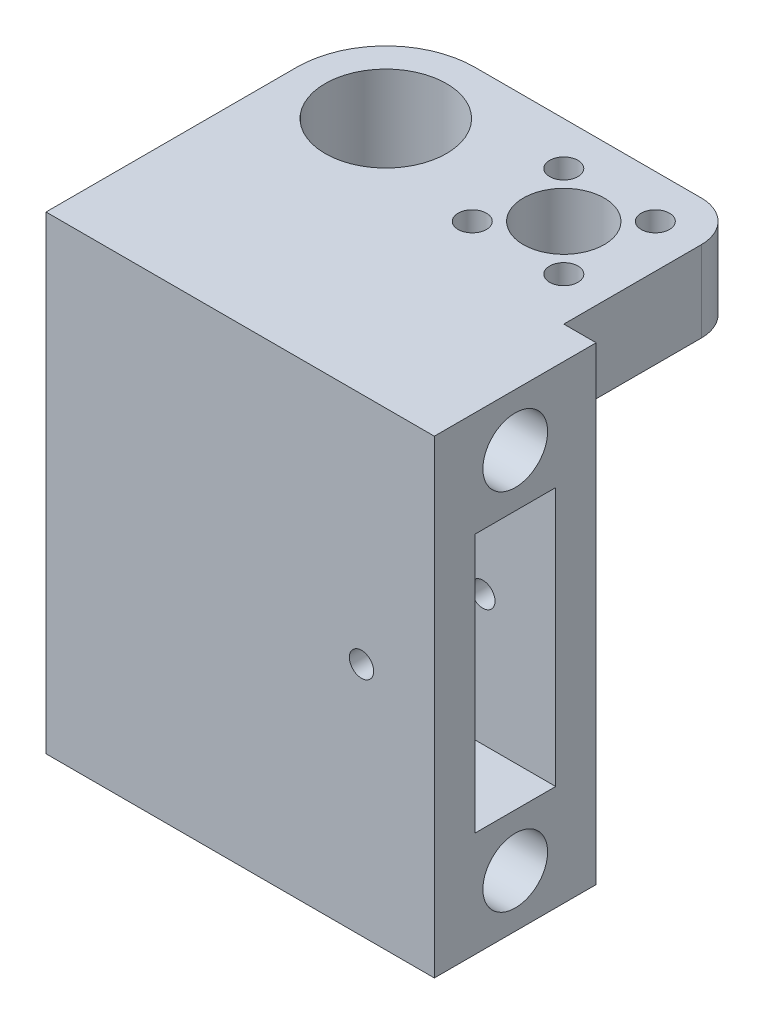
ISO-10303-21;
HEADER;
FILE_DESCRIPTION(('STEP AP214'),'2;1');
FILE_NAME('part.step','',(''),(''),'','','');
FILE_SCHEMA(('AUTOMOTIVE_DESIGN { 1 0 10303 214 1 1 1 1 }'));
ENDSEC;
DATA;
#1=APPLICATION_CONTEXT('core data for automotive mechanical design processes');
#2=APPLICATION_PROTOCOL_DEFINITION('international standard','automotive_design',2000,#1);
#3=PRODUCT_CONTEXT('',#1,'mechanical');
#4=PRODUCT('Part','Part','',(#3));
#5=PRODUCT_RELATED_PRODUCT_CATEGORY('part','',(#4));
#6=PRODUCT_DEFINITION_FORMATION('','',#4);
#7=PRODUCT_DEFINITION_CONTEXT('part definition',#1,'design');
#8=PRODUCT_DEFINITION('design','',#6,#7);
#9=PRODUCT_DEFINITION_SHAPE('','',#8);
#10=(LENGTH_UNIT() NAMED_UNIT(*) SI_UNIT(.MILLI.,.METRE.));
#11=(NAMED_UNIT(*) PLANE_ANGLE_UNIT() SI_UNIT($,.RADIAN.));
#12=(NAMED_UNIT(*) SI_UNIT($,.STERADIAN.) SOLID_ANGLE_UNIT());
#13=UNCERTAINTY_MEASURE_WITH_UNIT(LENGTH_MEASURE(1.E-05),#10,'distance_accuracy_value','');
#14=(GEOMETRIC_REPRESENTATION_CONTEXT(3) GLOBAL_UNCERTAINTY_ASSIGNED_CONTEXT((#13)) GLOBAL_UNIT_ASSIGNED_CONTEXT((#10,
#11,#12)) REPRESENTATION_CONTEXT('',''));
#15=CARTESIAN_POINT('',(0.,0.,0.));
#16=DIRECTION('',(0.,0.,1.));
#17=DIRECTION('',(1.,0.,0.));
#18=AXIS2_PLACEMENT_3D('',#15,#16,#17);
#19=CARTESIAN_POINT('',(0.,50.,0.));
#20=DIRECTION('',(0.,1.,0.));
#21=DIRECTION('',(0.,0.,1.));
#22=AXIS2_PLACEMENT_3D('',#19,#20,#21);
#23=PLANE('',#22);
#24=DIRECTION('',(0.,0.,1.));
#25=VECTOR('',#24,1.);
#26=CARTESIAN_POINT('',(11.,50.,11.));
#27=LINE('',#26,#25);
#28=CARTESIAN_POINT('',(11.,50.,0.));
#29=VERTEX_POINT('',#28);
#30=CARTESIAN_POINT('',(11.,50.,31.));
#31=VERTEX_POINT('',#30);
#32=EDGE_CURVE('E220',#29,#31,#27,.T.);
#33=ORIENTED_EDGE('',*,*,#32,.T.);
#34=DIRECTION('',(-1.,0.,0.));
#35=VECTOR('',#34,1.);
#36=CARTESIAN_POINT('',(11.,50.,31.));
#37=LINE('',#36,#35);
#38=CARTESIAN_POINT('',(59.,50.,31.));
#39=VERTEX_POINT('',#38);
#40=EDGE_CURVE('E203',#39,#31,#37,.T.);
#41=ORIENTED_EDGE('',*,*,#40,.F.);
#42=DIRECTION('',(0.,0.,-1.));
#43=VECTOR('',#42,1.);
#44=CARTESIAN_POINT('',(59.,50.,31.));
#45=LINE('',#44,#43);
#46=CARTESIAN_POINT('',(59.,50.,11.));
#47=VERTEX_POINT('',#46);
#48=EDGE_CURVE('E206',#39,#47,#45,.T.);
#49=ORIENTED_EDGE('',*,*,#48,.T.);
#50=DIRECTION('',(-1.,0.,0.));
#51=VECTOR('',#50,1.);
#52=CARTESIAN_POINT('',(11.,50.,11.));
#53=LINE('',#52,#51);
#54=CARTESIAN_POINT('',(55.,50.,11.));
#55=VERTEX_POINT('',#54);
#56=EDGE_CURVE('E199',#47,#55,#53,.T.);
#57=ORIENTED_EDGE('',*,*,#56,.T.);
#58=DIRECTION('',(0.,0.,1.));
#59=VECTOR('',#58,1.);
#60=CARTESIAN_POINT('',(55.,50.,11.));
#61=LINE('',#60,#59);
#62=CARTESIAN_POINT('',(55.,50.,-5.99999999999999));
#63=VERTEX_POINT('',#62);
#64=EDGE_CURVE('E283',#63,#55,#61,.T.);
#65=ORIENTED_EDGE('',*,*,#64,.F.);
#66=CARTESIAN_POINT('',(50.,50.,-5.99999999999999));
#67=DIRECTION('',(0.,-1.,0.));
#68=DIRECTION('',(0.,0.,-1.));
#69=AXIS2_PLACEMENT_3D('',#66,#67,#68);
#70=CIRCLE('',#69,5.);
#71=CARTESIAN_POINT('',(50.,50.,-11.));
#72=VERTEX_POINT('',#71);
#73=EDGE_CURVE('E255',#72,#63,#70,.T.);
#74=ORIENTED_EDGE('',*,*,#73,.F.);
#75=DIRECTION('',(1.,0.,0.));
#76=VECTOR('',#75,1.);
#77=CARTESIAN_POINT('',(33.,50.,-11.));
#78=LINE('',#77,#76);
#79=CARTESIAN_POINT('',(22.,50.,-11.));
#80=VERTEX_POINT('',#79);
#81=EDGE_CURVE('E291',#80,#72,#78,.T.);
#82=ORIENTED_EDGE('',*,*,#81,.F.);
#83=CARTESIAN_POINT('',(22.,50.,0.));
#84=DIRECTION('',(0.,-1.,0.));
#85=DIRECTION('',(0.,0.,1.));
#86=AXIS2_PLACEMENT_3D('',#83,#84,#85);
#87=CIRCLE('',#86,11.);
#88=EDGE_CURVE('E270',#29,#80,#87,.T.);
#89=ORIENTED_EDGE('',*,*,#88,.F.);
#90=EDGE_LOOP('',(#33,#41,#49,#57,#65,#74,#82,#89));
#91=FACE_BOUND('',#90,.T.);
#92=CARTESIAN_POINT('',(49.6568542494923,50.,5.65685424949236));
#93=DIRECTION('',(0.,-1.,0.));
#94=DIRECTION('',(0.,0.,1.));
#95=AXIS2_PLACEMENT_3D('',#92,#93,#94);
#96=CIRCLE('',#95,1.75);
#97=CARTESIAN_POINT('',(49.6568542494923,50.,7.40685424949236));
#98=VERTEX_POINT('',#97);
#99=EDGE_CURVE('E239',#98,#98,#96,.T.);
#100=ORIENTED_EDGE('',*,*,#99,.T.);
#101=EDGE_LOOP('',(#100));
#102=FACE_BOUND('',#101,.T.);
#103=CARTESIAN_POINT('',(38.3431457505075,50.,5.65685424949231));
#104=DIRECTION('',(0.,-1.,0.));
#105=DIRECTION('',(0.,0.,1.));
#106=AXIS2_PLACEMENT_3D('',#103,#104,#105);
#107=CIRCLE('',#106,1.75);
#108=CARTESIAN_POINT('',(38.3431457505075,50.,7.40685424949231));
#109=VERTEX_POINT('',#108);
#110=EDGE_CURVE('E327',#109,#109,#107,.T.);
#111=ORIENTED_EDGE('',*,*,#110,.T.);
#112=EDGE_LOOP('',(#111));
#113=FACE_BOUND('',#112,.T.);
#114=CARTESIAN_POINT('',(38.3431457505076,50.,-5.65685424949249));
#115=DIRECTION('',(0.,-1.,0.));
#116=DIRECTION('',(0.,0.,1.));
#117=AXIS2_PLACEMENT_3D('',#114,#115,#116);
#118=CIRCLE('',#117,1.75);
#119=CARTESIAN_POINT('',(38.3431457505076,50.,-3.90685424949249));
#120=VERTEX_POINT('',#119);
#121=EDGE_CURVE('E321',#120,#120,#118,.T.);
#122=ORIENTED_EDGE('',*,*,#121,.T.);
#123=EDGE_LOOP('',(#122));
#124=FACE_BOUND('',#123,.T.);
#125=CARTESIAN_POINT('',(49.6568542494924,50.,-5.65685424949236));
#126=DIRECTION('',(0.,-1.,0.));
#127=DIRECTION('',(0.,0.,1.));
#128=AXIS2_PLACEMENT_3D('',#125,#126,#127);
#129=CIRCLE('',#128,1.75);
#130=CARTESIAN_POINT('',(49.6568542494924,50.,-3.90685424949236));
#131=VERTEX_POINT('',#130);
#132=EDGE_CURVE('E315',#131,#131,#129,.T.);
#133=ORIENTED_EDGE('',*,*,#132,.T.);
#134=EDGE_LOOP('',(#133));
#135=FACE_BOUND('',#134,.T.);
#136=CARTESIAN_POINT('',(44.,50.,0.));
#137=DIRECTION('',(0.,-1.,0.));
#138=DIRECTION('',(0.,0.,1.));
#139=AXIS2_PLACEMENT_3D('',#136,#137,#138);
#140=CIRCLE('',#139,5.);
#141=CARTESIAN_POINT('',(44.,50.,5.00000000000003));
#142=VERTEX_POINT('',#141);
#143=EDGE_CURVE('E300',#142,#142,#140,.T.);
#144=ORIENTED_EDGE('',*,*,#143,.T.);
#145=EDGE_LOOP('',(#144));
#146=FACE_BOUND('',#145,.T.);
#147=CARTESIAN_POINT('',(22.,50.,0.));
#148=DIRECTION('',(0.,-1.,0.));
#149=DIRECTION('',(0.,0.,1.));
#150=AXIS2_PLACEMENT_3D('',#147,#148,#149);
#151=CIRCLE('',#150,7.5);
#152=CARTESIAN_POINT('',(22.,50.,7.5));
#153=VERTEX_POINT('',#152);
#154=EDGE_CURVE('E264',#153,#153,#151,.T.);
#155=ORIENTED_EDGE('',*,*,#154,.T.);
#156=EDGE_LOOP('',(#155));
#157=FACE_BOUND('',#156,.T.);
#158=ADVANCED_FACE('F36',(#91,#102,#113,#124,#135,#146,#157),#23,.T.);
#159=CARTESIAN_POINT('',(0.,0.,0.));
#160=DIRECTION('',(0.,1.,0.));
#161=DIRECTION('',(0.,0.,1.));
#162=AXIS2_PLACEMENT_3D('',#159,#160,#161);
#163=PLANE('',#162);
#164=DIRECTION('',(1.,0.,0.));
#165=VECTOR('',#164,1.);
#166=CARTESIAN_POINT('',(-11.,0.,11.));
#167=LINE('',#166,#165);
#168=CARTESIAN_POINT('',(11.,0.,11.));
#169=VERTEX_POINT('',#168);
#170=CARTESIAN_POINT('',(33.,0.,11.));
#171=VERTEX_POINT('',#170);
#172=EDGE_CURVE('E11',#169,#171,#167,.T.);
#173=ORIENTED_EDGE('',*,*,#172,.F.);
#174=DIRECTION('',(0.,0.,1.));
#175=VECTOR('',#174,1.);
#176=CARTESIAN_POINT('',(11.,0.,11.));
#177=LINE('',#176,#175);
#178=CARTESIAN_POINT('',(11.,0.,0.));
#179=VERTEX_POINT('',#178);
#180=EDGE_CURVE('E232',#179,#169,#177,.T.);
#181=ORIENTED_EDGE('',*,*,#180,.F.);
#182=CARTESIAN_POINT('',(22.,0.,0.));
#183=DIRECTION('',(0.,-1.,0.));
#184=DIRECTION('',(0.,0.,1.));
#185=AXIS2_PLACEMENT_3D('',#182,#183,#184);
#186=CIRCLE('',#185,11.);
#187=CARTESIAN_POINT('',(33.,0.,0.));
#188=VERTEX_POINT('',#187);
#189=EDGE_CURVE('E267',#179,#188,#186,.T.);
#190=ORIENTED_EDGE('',*,*,#189,.T.);
#191=DIRECTION('',(0.,0.,1.));
#192=VECTOR('',#191,1.);
#193=CARTESIAN_POINT('',(33.,0.,0.));
#194=LINE('',#193,#192);
#195=EDGE_CURVE('E274',#188,#171,#194,.T.);
#196=ORIENTED_EDGE('',*,*,#195,.T.);
#197=EDGE_LOOP('',(#173,#181,#190,#196));
#198=FACE_BOUND('',#197,.T.);
#199=CARTESIAN_POINT('',(22.,0.,0.));
#200=DIRECTION('',(0.,-1.,0.));
#201=DIRECTION('',(0.,0.,1.));
#202=AXIS2_PLACEMENT_3D('',#199,#200,#201);
#203=CIRCLE('',#202,7.5);
#204=CARTESIAN_POINT('',(22.,0.,7.5));
#205=VERTEX_POINT('',#204);
#206=EDGE_CURVE('E248',#205,#205,#203,.T.);
#207=ORIENTED_EDGE('',*,*,#206,.F.);
#208=EDGE_LOOP('',(#207));
#209=FACE_BOUND('',#208,.T.);
#210=ADVANCED_FACE('F38',(#198,#209),#163,.F.);
#211=CARTESIAN_POINT('',(22.,50.,0.));
#212=DIRECTION('',(0.,-1.,0.));
#213=DIRECTION('',(0.,0.,-1.));
#214=AXIS2_PLACEMENT_3D('',#211,#212,#213);
#215=CYLINDRICAL_SURFACE('',#214,11.);
#216=DIRECTION('',(0.,1.,0.));
#217=VECTOR('',#216,1.);
#218=CARTESIAN_POINT('',(22.,40.,-11.));
#219=LINE('',#218,#217);
#220=CARTESIAN_POINT('',(22.,40.,-11.));
#221=VERTEX_POINT('',#220);
#222=EDGE_CURVE('E260',#221,#80,#219,.T.);
#223=ORIENTED_EDGE('',*,*,#222,.F.);
#224=CARTESIAN_POINT('',(22.,40.,0.));
#225=DIRECTION('',(0.,1.,0.));
#226=DIRECTION('',(0.,0.,1.));
#227=AXIS2_PLACEMENT_3D('',#224,#225,#226);
#228=CIRCLE('',#227,11.);
#229=CARTESIAN_POINT('',(33.,40.,0.));
#230=VERTEX_POINT('',#229);
#231=EDGE_CURVE('E288',#230,#221,#228,.T.);
#232=ORIENTED_EDGE('',*,*,#231,.F.);
#233=DIRECTION('',(0.,-1.,0.));
#234=VECTOR('',#233,1.);
#235=CARTESIAN_POINT('',(33.,50.,0.));
#236=LINE('',#235,#234);
#237=EDGE_CURVE('E45',#230,#188,#236,.T.);
#238=ORIENTED_EDGE('',*,*,#237,.T.);
#239=ORIENTED_EDGE('',*,*,#189,.F.);
#240=DIRECTION('',(0.,-1.,0.));
#241=VECTOR('',#240,1.);
#242=CARTESIAN_POINT('',(11.,50.,0.));
#243=LINE('',#242,#241);
#244=EDGE_CURVE('E273',#29,#179,#243,.T.);
#245=ORIENTED_EDGE('',*,*,#244,.F.);
#246=ORIENTED_EDGE('',*,*,#88,.T.);
#247=EDGE_LOOP('',(#223,#232,#238,#239,#245,#246));
#248=FACE_BOUND('',#247,.T.);
#249=ADVANCED_FACE('F364',(#248),#215,.T.);
#250=CARTESIAN_POINT('',(33.,50.,0.));
#251=DIRECTION('',(-1.,0.,0.));
#252=DIRECTION('',(0.,0.,-1.));
#253=AXIS2_PLACEMENT_3D('',#250,#251,#252);
#254=PLANE('',#253);
#255=DIRECTION('',(0.,-1.,0.));
#256=VECTOR('',#255,1.);
#257=CARTESIAN_POINT('',(33.,50.,11.));
#258=LINE('',#257,#256);
#259=CARTESIAN_POINT('',(33.,40.,11.));
#260=VERTEX_POINT('',#259);
#261=EDGE_CURVE('E280',#260,#171,#258,.T.);
#262=ORIENTED_EDGE('',*,*,#261,.T.);
#263=ORIENTED_EDGE('',*,*,#195,.F.);
#264=ORIENTED_EDGE('',*,*,#237,.F.);
#265=DIRECTION('',(0.,0.,-1.));
#266=VECTOR('',#265,1.);
#267=CARTESIAN_POINT('',(33.,40.,0.));
#268=LINE('',#267,#266);
#269=EDGE_CURVE('E284',#260,#230,#268,.T.);
#270=ORIENTED_EDGE('',*,*,#269,.F.);
#271=EDGE_LOOP('',(#262,#263,#264,#270));
#272=FACE_BOUND('',#271,.T.);
#273=ADVANCED_FACE('F361',(#272),#254,.F.);
#274=CARTESIAN_POINT('',(22.,50.,0.));
#275=DIRECTION('',(0.,-1.,0.));
#276=DIRECTION('',(0.,0.,-1.));
#277=AXIS2_PLACEMENT_3D('',#274,#275,#276);
#278=CYLINDRICAL_SURFACE('',#277,7.5);
#279=ORIENTED_EDGE('',*,*,#154,.F.);
#280=EDGE_LOOP('',(#279));
#281=FACE_BOUND('',#280,.T.);
#282=ORIENTED_EDGE('',*,*,#206,.T.);
#283=EDGE_LOOP('',(#282));
#284=FACE_BOUND('',#283,.T.);
#285=ADVANCED_FACE('F410',(#281,#284),#278,.F.);
#286=CARTESIAN_POINT('',(55.,40.,11.));
#287=DIRECTION('',(1.,0.,0.));
#288=DIRECTION('',(0.,0.,1.));
#289=AXIS2_PLACEMENT_3D('',#286,#287,#288);
#290=PLANE('',#289);
#291=ORIENTED_EDGE('',*,*,#64,.T.);
#292=DIRECTION('',(0.,1.,0.));
#293=VECTOR('',#292,1.);
#294=CARTESIAN_POINT('',(55.,40.,11.));
#295=LINE('',#294,#293);
#296=CARTESIAN_POINT('',(55.,40.,11.));
#297=VERTEX_POINT('',#296);
#298=EDGE_CURVE('E242',#297,#55,#295,.T.);
#299=ORIENTED_EDGE('',*,*,#298,.F.);
#300=DIRECTION('',(0.,0.,1.));
#301=VECTOR('',#300,1.);
#302=CARTESIAN_POINT('',(55.,40.,11.));
#303=LINE('',#302,#301);
#304=CARTESIAN_POINT('',(55.,40.,-5.99999999999999));
#305=VERTEX_POINT('',#304);
#306=EDGE_CURVE('E304',#305,#297,#303,.T.);
#307=ORIENTED_EDGE('',*,*,#306,.F.);
#308=DIRECTION('',(0.,1.,0.));
#309=VECTOR('',#308,1.);
#310=CARTESIAN_POINT('',(55.,40.,-5.99999999999999));
#311=LINE('',#310,#309);
#312=EDGE_CURVE('E249',#305,#63,#311,.T.);
#313=ORIENTED_EDGE('',*,*,#312,.T.);
#314=EDGE_LOOP('',(#291,#299,#307,#313));
#315=FACE_BOUND('',#314,.T.);
#316=ADVANCED_FACE('F370',(#315),#290,.T.);
#317=CARTESIAN_POINT('',(50.,40.,-5.99999999999999));
#318=DIRECTION('',(0.,1.,0.));
#319=DIRECTION('',(0.,0.,1.));
#320=AXIS2_PLACEMENT_3D('',#317,#318,#319);
#321=CYLINDRICAL_SURFACE('',#320,5.);
#322=ORIENTED_EDGE('',*,*,#73,.T.);
#323=ORIENTED_EDGE('',*,*,#312,.F.);
#324=CARTESIAN_POINT('',(50.,40.,-5.99999999999999));
#325=DIRECTION('',(0.,-1.,0.));
#326=DIRECTION('',(0.,0.,-1.));
#327=AXIS2_PLACEMENT_3D('',#324,#325,#326);
#328=CIRCLE('',#327,5.);
#329=CARTESIAN_POINT('',(50.,40.,-11.));
#330=VERTEX_POINT('',#329);
#331=EDGE_CURVE('E306',#330,#305,#328,.T.);
#332=ORIENTED_EDGE('',*,*,#331,.F.);
#333=DIRECTION('',(0.,1.,0.));
#334=VECTOR('',#333,1.);
#335=CARTESIAN_POINT('',(50.,40.,-11.));
#336=LINE('',#335,#334);
#337=EDGE_CURVE('E258',#330,#72,#336,.T.);
#338=ORIENTED_EDGE('',*,*,#337,.T.);
#339=EDGE_LOOP('',(#322,#323,#332,#338));
#340=FACE_BOUND('',#339,.T.);
#341=ADVANCED_FACE('F369',(#340),#321,.T.);
#342=CARTESIAN_POINT('',(33.,40.,-11.));
#343=DIRECTION('',(0.,0.,-1.));
#344=DIRECTION('',(1.,0.,0.));
#345=AXIS2_PLACEMENT_3D('',#342,#343,#344);
#346=PLANE('',#345);
#347=ORIENTED_EDGE('',*,*,#81,.T.);
#348=ORIENTED_EDGE('',*,*,#337,.F.);
#349=DIRECTION('',(1.,0.,0.));
#350=VECTOR('',#349,1.);
#351=CARTESIAN_POINT('',(33.,40.,-11.));
#352=LINE('',#351,#350);
#353=EDGE_CURVE('E308',#221,#330,#352,.T.);
#354=ORIENTED_EDGE('',*,*,#353,.F.);
#355=ORIENTED_EDGE('',*,*,#222,.T.);
#356=EDGE_LOOP('',(#347,#348,#354,#355));
#357=FACE_BOUND('',#356,.T.);
#358=ADVANCED_FACE('F344',(#357),#346,.T.);
#359=CARTESIAN_POINT('',(50.,40.,-5.99999999999999));
#360=DIRECTION('',(0.,-1.,0.));
#361=DIRECTION('',(0.,0.,-1.));
#362=AXIS2_PLACEMENT_3D('',#359,#360,#361);
#363=PLANE('',#362);
#364=CARTESIAN_POINT('',(49.6568542494923,40.,5.65685424949236));
#365=DIRECTION('',(0.,-1.,0.));
#366=DIRECTION('',(0.,0.,1.));
#367=AXIS2_PLACEMENT_3D('',#364,#365,#366);
#368=CIRCLE('',#367,1.75);
#369=CARTESIAN_POINT('',(49.6568542494923,40.,7.40685424949236));
#370=VERTEX_POINT('',#369);
#371=EDGE_CURVE('E330',#370,#370,#368,.T.);
#372=ORIENTED_EDGE('',*,*,#371,.F.);
#373=EDGE_LOOP('',(#372));
#374=FACE_BOUND('',#373,.T.);
#375=CARTESIAN_POINT('',(38.3431457505075,40.,5.65685424949231));
#376=DIRECTION('',(0.,-1.,0.));
#377=DIRECTION('',(0.,0.,1.));
#378=AXIS2_PLACEMENT_3D('',#375,#376,#377);
#379=CIRCLE('',#378,1.75);
#380=CARTESIAN_POINT('',(38.3431457505075,40.,7.40685424949231));
#381=VERTEX_POINT('',#380);
#382=EDGE_CURVE('E324',#381,#381,#379,.T.);
#383=ORIENTED_EDGE('',*,*,#382,.F.);
#384=EDGE_LOOP('',(#383));
#385=FACE_BOUND('',#384,.T.);
#386=CARTESIAN_POINT('',(38.3431457505076,40.,-5.65685424949249));
#387=DIRECTION('',(0.,-1.,0.));
#388=DIRECTION('',(0.,0.,1.));
#389=AXIS2_PLACEMENT_3D('',#386,#387,#388);
#390=CIRCLE('',#389,1.75);
#391=CARTESIAN_POINT('',(38.3431457505076,40.,-3.90685424949249));
#392=VERTEX_POINT('',#391);
#393=EDGE_CURVE('E318',#392,#392,#390,.T.);
#394=ORIENTED_EDGE('',*,*,#393,.F.);
#395=EDGE_LOOP('',(#394));
#396=FACE_BOUND('',#395,.T.);
#397=CARTESIAN_POINT('',(49.6568542494924,40.,-5.65685424949236));
#398=DIRECTION('',(0.,-1.,0.));
#399=DIRECTION('',(0.,0.,1.));
#400=AXIS2_PLACEMENT_3D('',#397,#398,#399);
#401=CIRCLE('',#400,1.75);
#402=CARTESIAN_POINT('',(49.6568542494924,40.,-3.90685424949236));
#403=VERTEX_POINT('',#402);
#404=EDGE_CURVE('E313',#403,#403,#401,.T.);
#405=ORIENTED_EDGE('',*,*,#404,.F.);
#406=EDGE_LOOP('',(#405));
#407=FACE_BOUND('',#406,.T.);
#408=CARTESIAN_POINT('',(44.,40.,0.));
#409=DIRECTION('',(0.,-1.,0.));
#410=DIRECTION('',(0.,0.,1.));
#411=AXIS2_PLACEMENT_3D('',#408,#409,#410);
#412=CIRCLE('',#411,5.);
#413=CARTESIAN_POINT('',(44.,40.,5.00000000000003));
#414=VERTEX_POINT('',#413);
#415=EDGE_CURVE('E296',#414,#414,#412,.T.);
#416=ORIENTED_EDGE('',*,*,#415,.F.);
#417=EDGE_LOOP('',(#416));
#418=FACE_BOUND('',#417,.T.);
#419=ORIENTED_EDGE('',*,*,#269,.T.);
#420=ORIENTED_EDGE('',*,*,#231,.T.);
#421=ORIENTED_EDGE('',*,*,#353,.T.);
#422=ORIENTED_EDGE('',*,*,#331,.T.);
#423=ORIENTED_EDGE('',*,*,#306,.T.);
#424=DIRECTION('',(-1.,0.,0.));
#425=VECTOR('',#424,1.);
#426=CARTESIAN_POINT('',(33.,40.,11.));
#427=LINE('',#426,#425);
#428=EDGE_CURVE('E263',#297,#260,#427,.T.);
#429=ORIENTED_EDGE('',*,*,#428,.T.);
#430=EDGE_LOOP('',(#419,#420,#421,#422,#423,#429));
#431=FACE_BOUND('',#430,.T.);
#432=ADVANCED_FACE('F340',(#374,#385,#396,#407,#418,#431),#363,.T.);
#433=CARTESIAN_POINT('',(44.,40.,0.));
#434=DIRECTION('',(0.,1.,0.));
#435=DIRECTION('',(0.,0.,1.));
#436=AXIS2_PLACEMENT_3D('',#433,#434,#435);
#437=CYLINDRICAL_SURFACE('',#436,5.);
#438=ORIENTED_EDGE('',*,*,#415,.T.);
#439=EDGE_LOOP('',(#438));
#440=FACE_BOUND('',#439,.T.);
#441=ORIENTED_EDGE('',*,*,#143,.F.);
#442=EDGE_LOOP('',(#441));
#443=FACE_BOUND('',#442,.T.);
#444=ADVANCED_FACE('F343',(#440,#443),#437,.F.);
#445=CARTESIAN_POINT('',(49.6568542494924,40.,-5.65685424949236));
#446=DIRECTION('',(0.,1.,0.));
#447=DIRECTION('',(0.,0.,1.));
#448=AXIS2_PLACEMENT_3D('',#445,#446,#447);
#449=CYLINDRICAL_SURFACE('',#448,1.75);
#450=ORIENTED_EDGE('',*,*,#404,.T.);
#451=EDGE_LOOP('',(#450));
#452=FACE_BOUND('',#451,.T.);
#453=ORIENTED_EDGE('',*,*,#132,.F.);
#454=EDGE_LOOP('',(#453));
#455=FACE_BOUND('',#454,.T.);
#456=ADVANCED_FACE('F422',(#452,#455),#449,.F.);
#457=CARTESIAN_POINT('',(38.3431457505076,40.,-5.65685424949249));
#458=DIRECTION('',(0.,1.,0.));
#459=DIRECTION('',(0.,0.,1.));
#460=AXIS2_PLACEMENT_3D('',#457,#458,#459);
#461=CYLINDRICAL_SURFACE('',#460,1.75);
#462=ORIENTED_EDGE('',*,*,#393,.T.);
#463=EDGE_LOOP('',(#462));
#464=FACE_BOUND('',#463,.T.);
#465=ORIENTED_EDGE('',*,*,#121,.F.);
#466=EDGE_LOOP('',(#465));
#467=FACE_BOUND('',#466,.T.);
#468=ADVANCED_FACE('F426',(#464,#467),#461,.F.);
#469=CARTESIAN_POINT('',(38.3431457505075,40.,5.65685424949231));
#470=DIRECTION('',(0.,1.,0.));
#471=DIRECTION('',(0.,0.,1.));
#472=AXIS2_PLACEMENT_3D('',#469,#470,#471);
#473=CYLINDRICAL_SURFACE('',#472,1.75);
#474=ORIENTED_EDGE('',*,*,#382,.T.);
#475=EDGE_LOOP('',(#474));
#476=FACE_BOUND('',#475,.T.);
#477=ORIENTED_EDGE('',*,*,#110,.F.);
#478=EDGE_LOOP('',(#477));
#479=FACE_BOUND('',#478,.T.);
#480=ADVANCED_FACE('F430',(#476,#479),#473,.F.);
#481=CARTESIAN_POINT('',(49.6568542494923,40.,5.65685424949236));
#482=DIRECTION('',(0.,1.,0.));
#483=DIRECTION('',(0.,0.,1.));
#484=AXIS2_PLACEMENT_3D('',#481,#482,#483);
#485=CYLINDRICAL_SURFACE('',#484,1.75);
#486=ORIENTED_EDGE('',*,*,#371,.T.);
#487=EDGE_LOOP('',(#486));
#488=FACE_BOUND('',#487,.T.);
#489=ORIENTED_EDGE('',*,*,#99,.F.);
#490=EDGE_LOOP('',(#489));
#491=FACE_BOUND('',#490,.T.);
#492=ADVANCED_FACE('F337',(#488,#491),#485,.F.);
#493=CARTESIAN_POINT('',(11.,50.,11.));
#494=DIRECTION('',(1.,0.,0.));
#495=DIRECTION('',(0.,0.,-1.));
#496=AXIS2_PLACEMENT_3D('',#493,#494,#495);
#497=PLANE('',#496);
#498=DIRECTION('',(0.,0.,-1.));
#499=VECTOR('',#498,1.);
#500=CARTESIAN_POINT('',(11.,5.,11.));
#501=LINE('',#500,#499);
#502=CARTESIAN_POINT('',(11.,5.,26.));
#503=VERTEX_POINT('',#502);
#504=CARTESIAN_POINT('',(11.,5.,16.));
#505=VERTEX_POINT('',#504);
#506=EDGE_CURVE('E176',#503,#505,#501,.T.);
#507=ORIENTED_EDGE('',*,*,#506,.T.);
#508=DIRECTION('',(0.,1.,0.));
#509=VECTOR('',#508,1.);
#510=CARTESIAN_POINT('',(11.,50.,16.));
#511=LINE('',#510,#509);
#512=CARTESIAN_POINT('',(11.,37.,16.));
#513=VERTEX_POINT('',#512);
#514=EDGE_CURVE('E179',#505,#513,#511,.T.);
#515=ORIENTED_EDGE('',*,*,#514,.T.);
#516=DIRECTION('',(0.,0.,1.));
#517=VECTOR('',#516,1.);
#518=CARTESIAN_POINT('',(11.,37.,11.));
#519=LINE('',#518,#517);
#520=CARTESIAN_POINT('',(11.,37.,26.));
#521=VERTEX_POINT('',#520);
#522=EDGE_CURVE('E171',#513,#521,#519,.T.);
#523=ORIENTED_EDGE('',*,*,#522,.T.);
#524=DIRECTION('',(0.,-1.,0.));
#525=VECTOR('',#524,1.);
#526=CARTESIAN_POINT('',(11.,50.,26.));
#527=LINE('',#526,#525);
#528=EDGE_CURVE('E151',#521,#503,#527,.T.);
#529=ORIENTED_EDGE('',*,*,#528,.T.);
#530=EDGE_LOOP('',(#507,#515,#523,#529));
#531=FACE_BOUND('',#530,.T.);
#532=CARTESIAN_POINT('',(11.,-1.5,21.));
#533=DIRECTION('',(1.,0.,0.));
#534=DIRECTION('',(0.,0.,-1.));
#535=AXIS2_PLACEMENT_3D('',#532,#533,#534);
#536=CIRCLE('',#535,4.);
#537=CARTESIAN_POINT('',(11.,-1.5,17.));
#538=VERTEX_POINT('',#537);
#539=EDGE_CURVE('E185',#538,#538,#536,.T.);
#540=ORIENTED_EDGE('',*,*,#539,.T.);
#541=EDGE_LOOP('',(#540));
#542=FACE_BOUND('',#541,.T.);
#543=CARTESIAN_POINT('',(11.,43.5,21.));
#544=DIRECTION('',(1.,0.,0.));
#545=DIRECTION('',(0.,0.,-1.));
#546=AXIS2_PLACEMENT_3D('',#543,#544,#545);
#547=CIRCLE('',#546,4.);
#548=CARTESIAN_POINT('',(11.,43.5,17.));
#549=VERTEX_POINT('',#548);
#550=EDGE_CURVE('E191',#549,#549,#547,.T.);
#551=ORIENTED_EDGE('',*,*,#550,.T.);
#552=EDGE_LOOP('',(#551));
#553=FACE_BOUND('',#552,.T.);
#554=ORIENTED_EDGE('',*,*,#244,.T.);
#555=ORIENTED_EDGE('',*,*,#180,.T.);
#556=DIRECTION('',(0.,-1.,0.));
#557=VECTOR('',#556,1.);
#558=CARTESIAN_POINT('',(11.,50.,11.));
#559=LINE('',#558,#557);
#560=CARTESIAN_POINT('',(11.,-8.,11.));
#561=VERTEX_POINT('',#560);
#562=EDGE_CURVE('E194',#169,#561,#559,.T.);
#563=ORIENTED_EDGE('',*,*,#562,.T.);
#564=DIRECTION('',(0.,0.,-1.));
#565=VECTOR('',#564,1.);
#566=CARTESIAN_POINT('',(11.,-8.,31.));
#567=LINE('',#566,#565);
#568=CARTESIAN_POINT('',(11.,-8.,31.));
#569=VERTEX_POINT('',#568);
#570=EDGE_CURVE('E214',#569,#561,#567,.T.);
#571=ORIENTED_EDGE('',*,*,#570,.F.);
#572=DIRECTION('',(0.,-1.,0.));
#573=VECTOR('',#572,1.);
#574=CARTESIAN_POINT('',(11.,50.,31.));
#575=LINE('',#574,#573);
#576=EDGE_CURVE('E195',#31,#569,#575,.T.);
#577=ORIENTED_EDGE('',*,*,#576,.F.);
#578=ORIENTED_EDGE('',*,*,#32,.F.);
#579=EDGE_LOOP('',(#554,#555,#563,#571,#577,#578));
#580=FACE_BOUND('',#579,.T.);
#581=ADVANCED_FACE('F377',(#531,#542,#553,#580),#497,.F.);
#582=CARTESIAN_POINT('',(0.,0.,11.));
#583=DIRECTION('',(0.,0.,1.));
#584=DIRECTION('',(1.,0.,0.));
#585=AXIS2_PLACEMENT_3D('',#582,#583,#584);
#586=PLANE('',#585);
#587=CARTESIAN_POINT('',(50.,21.08,11.));
#588=DIRECTION('',(0.,0.,-1.));
#589=DIRECTION('',(-1.,0.,0.));
#590=AXIS2_PLACEMENT_3D('',#587,#588,#589);
#591=CIRCLE('',#590,1.5);
#592=CARTESIAN_POINT('',(48.5,21.08,11.));
#593=VERTEX_POINT('',#592);
#594=EDGE_CURVE('E447',#593,#593,#591,.T.);
#595=ORIENTED_EDGE('',*,*,#594,.F.);
#596=EDGE_LOOP('',(#595));
#597=FACE_BOUND('',#596,.T.);
#598=ORIENTED_EDGE('',*,*,#562,.F.);
#599=ORIENTED_EDGE('',*,*,#172,.T.);
#600=ORIENTED_EDGE('',*,*,#261,.F.);
#601=ORIENTED_EDGE('',*,*,#428,.F.);
#602=ORIENTED_EDGE('',*,*,#298,.T.);
#603=ORIENTED_EDGE('',*,*,#56,.F.);
#604=DIRECTION('',(0.,1.,0.));
#605=VECTOR('',#604,1.);
#606=CARTESIAN_POINT('',(59.,50.,11.));
#607=LINE('',#606,#605);
#608=CARTESIAN_POINT('',(59.,-8.,11.));
#609=VERTEX_POINT('',#608);
#610=EDGE_CURVE('E219',#609,#47,#607,.T.);
#611=ORIENTED_EDGE('',*,*,#610,.F.);
#612=DIRECTION('',(1.,0.,0.));
#613=VECTOR('',#612,1.);
#614=CARTESIAN_POINT('',(11.,-8.,11.));
#615=LINE('',#614,#613);
#616=EDGE_CURVE('E209',#561,#609,#615,.T.);
#617=ORIENTED_EDGE('',*,*,#616,.F.);
#618=EDGE_LOOP('',(#598,#599,#600,#601,#602,#603,#611,#617));
#619=FACE_BOUND('',#618,.T.);
#620=ADVANCED_FACE('F374',(#597,#619),#586,.F.);
#621=CARTESIAN_POINT('',(11.,-8.,31.));
#622=DIRECTION('',(0.,1.,0.));
#623=DIRECTION('',(0.,0.,1.));
#624=AXIS2_PLACEMENT_3D('',#621,#622,#623);
#625=PLANE('',#624);
#626=ORIENTED_EDGE('',*,*,#616,.T.);
#627=DIRECTION('',(0.,0.,-1.));
#628=VECTOR('',#627,1.);
#629=CARTESIAN_POINT('',(59.,-8.,31.));
#630=LINE('',#629,#628);
#631=CARTESIAN_POINT('',(59.,-8.,31.));
#632=VERTEX_POINT('',#631);
#633=EDGE_CURVE('E225',#632,#609,#630,.T.);
#634=ORIENTED_EDGE('',*,*,#633,.F.);
#635=DIRECTION('',(1.,0.,0.));
#636=VECTOR('',#635,1.);
#637=CARTESIAN_POINT('',(11.,-8.,31.));
#638=LINE('',#637,#636);
#639=EDGE_CURVE('E198',#569,#632,#638,.T.);
#640=ORIENTED_EDGE('',*,*,#639,.F.);
#641=ORIENTED_EDGE('',*,*,#570,.T.);
#642=EDGE_LOOP('',(#626,#634,#640,#641));
#643=FACE_BOUND('',#642,.T.);
#644=ADVANCED_FACE('F384',(#643),#625,.F.);
#645=CARTESIAN_POINT('',(59.,50.,31.));
#646=DIRECTION('',(-1.,0.,0.));
#647=DIRECTION('',(0.,-1.,0.));
#648=AXIS2_PLACEMENT_3D('',#645,#646,#647);
#649=PLANE('',#648);
#650=DIRECTION('',(0.,0.,1.));
#651=VECTOR('',#650,1.);
#652=CARTESIAN_POINT('',(59.,37.,26.));
#653=LINE('',#652,#651);
#654=CARTESIAN_POINT('',(59.,37.,16.));
#655=VERTEX_POINT('',#654);
#656=CARTESIAN_POINT('',(59.,37.,26.));
#657=VERTEX_POINT('',#656);
#658=EDGE_CURVE('E157',#655,#657,#653,.T.);
#659=ORIENTED_EDGE('',*,*,#658,.F.);
#660=DIRECTION('',(0.,1.,0.));
#661=VECTOR('',#660,1.);
#662=CARTESIAN_POINT('',(59.,5.00000000000001,16.));
#663=LINE('',#662,#661);
#664=CARTESIAN_POINT('',(59.,5.00000000000001,16.));
#665=VERTEX_POINT('',#664);
#666=EDGE_CURVE('E61',#665,#655,#663,.T.);
#667=ORIENTED_EDGE('',*,*,#666,.F.);
#668=DIRECTION('',(0.,0.,-1.));
#669=VECTOR('',#668,1.);
#670=CARTESIAN_POINT('',(59.,5.00000000000001,26.));
#671=LINE('',#670,#669);
#672=CARTESIAN_POINT('',(59.,5.00000000000001,26.));
#673=VERTEX_POINT('',#672);
#674=EDGE_CURVE('E164',#673,#665,#671,.T.);
#675=ORIENTED_EDGE('',*,*,#674,.F.);
#676=DIRECTION('',(0.,-1.,0.));
#677=VECTOR('',#676,1.);
#678=CARTESIAN_POINT('',(59.,5.00000000000001,26.));
#679=LINE('',#678,#677);
#680=EDGE_CURVE('E148',#657,#673,#679,.T.);
#681=ORIENTED_EDGE('',*,*,#680,.F.);
#682=EDGE_LOOP('',(#659,#667,#675,#681));
#683=FACE_BOUND('',#682,.T.);
#684=CARTESIAN_POINT('',(59.,-1.5,21.));
#685=DIRECTION('',(1.,0.,0.));
#686=DIRECTION('',(0.,1.,0.));
#687=AXIS2_PLACEMENT_3D('',#684,#685,#686);
#688=CIRCLE('',#687,4.);
#689=CARTESIAN_POINT('',(59.,2.5,21.));
#690=VERTEX_POINT('',#689);
#691=EDGE_CURVE('E182',#690,#690,#688,.T.);
#692=ORIENTED_EDGE('',*,*,#691,.F.);
#693=EDGE_LOOP('',(#692));
#694=FACE_BOUND('',#693,.T.);
#695=CARTESIAN_POINT('',(59.,43.5,21.));
#696=DIRECTION('',(1.,0.,0.));
#697=DIRECTION('',(0.,1.,0.));
#698=AXIS2_PLACEMENT_3D('',#695,#696,#697);
#699=CIRCLE('',#698,4.);
#700=CARTESIAN_POINT('',(59.,47.5,21.));
#701=VERTEX_POINT('',#700);
#702=EDGE_CURVE('E188',#701,#701,#699,.T.);
#703=ORIENTED_EDGE('',*,*,#702,.F.);
#704=EDGE_LOOP('',(#703));
#705=FACE_BOUND('',#704,.T.);
#706=ORIENTED_EDGE('',*,*,#610,.T.);
#707=ORIENTED_EDGE('',*,*,#48,.F.);
#708=DIRECTION('',(0.,1.,0.));
#709=VECTOR('',#708,1.);
#710=CARTESIAN_POINT('',(59.,50.,31.));
#711=LINE('',#710,#709);
#712=EDGE_CURVE('E201',#632,#39,#711,.T.);
#713=ORIENTED_EDGE('',*,*,#712,.F.);
#714=ORIENTED_EDGE('',*,*,#633,.T.);
#715=EDGE_LOOP('',(#706,#707,#713,#714));
#716=FACE_BOUND('',#715,.T.);
#717=ADVANCED_FACE('F161',(#683,#694,#705,#716),#649,.F.);
#718=CARTESIAN_POINT('',(0.,0.,31.));
#719=DIRECTION('',(0.,0.,1.));
#720=DIRECTION('',(1.,0.,0.));
#721=AXIS2_PLACEMENT_3D('',#718,#719,#720);
#722=PLANE('',#721);
#723=CARTESIAN_POINT('',(50.,21.08,31.));
#724=DIRECTION('',(0.,0.,-1.));
#725=DIRECTION('',(-1.,0.,0.));
#726=AXIS2_PLACEMENT_3D('',#723,#724,#725);
#727=CIRCLE('',#726,1.5);
#728=CARTESIAN_POINT('',(48.5,21.08,31.));
#729=VERTEX_POINT('',#728);
#730=EDGE_CURVE('E449',#729,#729,#727,.T.);
#731=ORIENTED_EDGE('',*,*,#730,.T.);
#732=EDGE_LOOP('',(#731));
#733=FACE_BOUND('',#732,.T.);
#734=ORIENTED_EDGE('',*,*,#576,.T.);
#735=ORIENTED_EDGE('',*,*,#639,.T.);
#736=ORIENTED_EDGE('',*,*,#712,.T.);
#737=ORIENTED_EDGE('',*,*,#40,.T.);
#738=EDGE_LOOP('',(#734,#735,#736,#737));
#739=FACE_BOUND('',#738,.T.);
#740=ADVANCED_FACE('F386',(#733,#739),#722,.T.);
#741=CARTESIAN_POINT('',(8.99999999999999,43.5,21.));
#742=DIRECTION('',(1.,0.,0.));
#743=DIRECTION('',(0.,1.,0.));
#744=AXIS2_PLACEMENT_3D('',#741,#742,#743);
#745=CYLINDRICAL_SURFACE('',#744,4.);
#746=ORIENTED_EDGE('',*,*,#702,.T.);
#747=EDGE_LOOP('',(#746));
#748=FACE_BOUND('',#747,.T.);
#749=ORIENTED_EDGE('',*,*,#550,.F.);
#750=EDGE_LOOP('',(#749));
#751=FACE_BOUND('',#750,.T.);
#752=ADVANCED_FACE('F388',(#748,#751),#745,.F.);
#753=CARTESIAN_POINT('',(9.,-1.5,21.));
#754=DIRECTION('',(1.,0.,0.));
#755=DIRECTION('',(0.,1.,0.));
#756=AXIS2_PLACEMENT_3D('',#753,#754,#755);
#757=CYLINDRICAL_SURFACE('',#756,4.);
#758=ORIENTED_EDGE('',*,*,#691,.T.);
#759=EDGE_LOOP('',(#758));
#760=FACE_BOUND('',#759,.T.);
#761=ORIENTED_EDGE('',*,*,#539,.F.);
#762=EDGE_LOOP('',(#761));
#763=FACE_BOUND('',#762,.T.);
#764=ADVANCED_FACE('F395',(#760,#763),#757,.F.);
#765=CARTESIAN_POINT('',(9.,5.,16.));
#766=DIRECTION('',(0.,0.,-1.));
#767=DIRECTION('',(-1.,0.,0.));
#768=AXIS2_PLACEMENT_3D('',#765,#766,#767);
#769=PLANE('',#768);
#770=CARTESIAN_POINT('',(50.,21.08,16.));
#771=DIRECTION('',(0.,0.,-1.));
#772=DIRECTION('',(-1.,0.,0.));
#773=AXIS2_PLACEMENT_3D('',#770,#771,#772);
#774=CIRCLE('',#773,1.5);
#775=CARTESIAN_POINT('',(48.5,21.08,16.));
#776=VERTEX_POINT('',#775);
#777=EDGE_CURVE('E453',#776,#776,#774,.T.);
#778=ORIENTED_EDGE('',*,*,#777,.T.);
#779=EDGE_LOOP('',(#778));
#780=FACE_BOUND('',#779,.T.);
#781=DIRECTION('',(1.,0.,0.));
#782=VECTOR('',#781,1.);
#783=CARTESIAN_POINT('',(9.,5.,16.));
#784=LINE('',#783,#782);
#785=EDGE_CURVE('E169',#505,#665,#784,.T.);
#786=ORIENTED_EDGE('',*,*,#785,.T.);
#787=ORIENTED_EDGE('',*,*,#666,.T.);
#788=DIRECTION('',(1.,0.,0.));
#789=VECTOR('',#788,1.);
#790=CARTESIAN_POINT('',(8.99999999999999,37.,16.));
#791=LINE('',#790,#789);
#792=EDGE_CURVE('E154',#513,#655,#791,.T.);
#793=ORIENTED_EDGE('',*,*,#792,.F.);
#794=ORIENTED_EDGE('',*,*,#514,.F.);
#795=EDGE_LOOP('',(#786,#787,#793,#794));
#796=FACE_BOUND('',#795,.T.);
#797=ADVANCED_FACE('F476',(#780,#796),#769,.F.);
#798=CARTESIAN_POINT('',(9.,5.,26.));
#799=DIRECTION('',(0.,-1.,0.));
#800=DIRECTION('',(1.,0.,0.));
#801=AXIS2_PLACEMENT_3D('',#798,#799,#800);
#802=PLANE('',#801);
#803=DIRECTION('',(1.,0.,0.));
#804=VECTOR('',#803,1.);
#805=CARTESIAN_POINT('',(9.,5.,26.));
#806=LINE('',#805,#804);
#807=EDGE_CURVE('E153',#503,#673,#806,.T.);
#808=ORIENTED_EDGE('',*,*,#807,.T.);
#809=ORIENTED_EDGE('',*,*,#674,.T.);
#810=ORIENTED_EDGE('',*,*,#785,.F.);
#811=ORIENTED_EDGE('',*,*,#506,.F.);
#812=EDGE_LOOP('',(#808,#809,#810,#811));
#813=FACE_BOUND('',#812,.T.);
#814=ADVANCED_FACE('F473',(#813),#802,.F.);
#815=CARTESIAN_POINT('',(9.,5.,26.));
#816=DIRECTION('',(0.,0.,1.));
#817=DIRECTION('',(1.,0.,0.));
#818=AXIS2_PLACEMENT_3D('',#815,#816,#817);
#819=PLANE('',#818);
#820=CARTESIAN_POINT('',(50.,21.08,26.));
#821=DIRECTION('',(0.,0.,1.));
#822=DIRECTION('',(1.,0.,0.));
#823=AXIS2_PLACEMENT_3D('',#820,#821,#822);
#824=CIRCLE('',#823,1.5);
#825=CARTESIAN_POINT('',(51.5,21.08,26.));
#826=VERTEX_POINT('',#825);
#827=EDGE_CURVE('E40',#826,#826,#824,.T.);
#828=ORIENTED_EDGE('',*,*,#827,.T.);
#829=EDGE_LOOP('',(#828));
#830=FACE_BOUND('',#829,.T.);
#831=DIRECTION('',(1.,0.,0.));
#832=VECTOR('',#831,1.);
#833=CARTESIAN_POINT('',(8.99999999999999,37.,26.));
#834=LINE('',#833,#832);
#835=EDGE_CURVE('E53',#521,#657,#834,.T.);
#836=ORIENTED_EDGE('',*,*,#835,.T.);
#837=ORIENTED_EDGE('',*,*,#680,.T.);
#838=ORIENTED_EDGE('',*,*,#807,.F.);
#839=ORIENTED_EDGE('',*,*,#528,.F.);
#840=EDGE_LOOP('',(#836,#837,#838,#839));
#841=FACE_BOUND('',#840,.T.);
#842=ADVANCED_FACE('F145',(#830,#841),#819,.F.);
#843=CARTESIAN_POINT('',(8.99999999999999,37.,26.));
#844=DIRECTION('',(0.,1.,0.));
#845=DIRECTION('',(-1.,0.,0.));
#846=AXIS2_PLACEMENT_3D('',#843,#844,#845);
#847=PLANE('',#846);
#848=ORIENTED_EDGE('',*,*,#792,.T.);
#849=ORIENTED_EDGE('',*,*,#658,.T.);
#850=ORIENTED_EDGE('',*,*,#835,.F.);
#851=ORIENTED_EDGE('',*,*,#522,.F.);
#852=EDGE_LOOP('',(#848,#849,#850,#851));
#853=FACE_BOUND('',#852,.T.);
#854=ADVANCED_FACE('F158',(#853),#847,.F.);
#855=CARTESIAN_POINT('',(50.,21.08,31.));
#856=DIRECTION('',(0.,0.,-1.));
#857=DIRECTION('',(-1.,0.,0.));
#858=AXIS2_PLACEMENT_3D('',#855,#856,#857);
#859=CYLINDRICAL_SURFACE('',#858,1.5);
#860=ORIENTED_EDGE('',*,*,#730,.F.);
#861=EDGE_LOOP('',(#860));
#862=FACE_BOUND('',#861,.T.);
#863=ORIENTED_EDGE('',*,*,#827,.F.);
#864=EDGE_LOOP('',(#863));
#865=FACE_BOUND('',#864,.T.);
#866=ADVANCED_FACE('F461',(#862,#865),#859,.F.);
#867=ORIENTED_EDGE('',*,*,#594,.T.);
#868=EDGE_LOOP('',(#867));
#869=FACE_BOUND('',#868,.T.);
#870=ORIENTED_EDGE('',*,*,#777,.F.);
#871=EDGE_LOOP('',(#870));
#872=FACE_BOUND('',#871,.T.);
#873=ADVANCED_FACE('F463',(#869,#872),#859,.F.);
#874=CLOSED_SHELL('',(#158,#210,#249,#273,#285,#316,#341,#358,#432,#444,#456,#468,#480,#492,
#581,#620,#644,#717,#740,#752,#764,#797,#814,#842,#854,#866,#873));
#875=MANIFOLD_SOLID_BREP('B2',#874);
#876=ADVANCED_BREP_SHAPE_REPRESENTATION('',(#18,#875),#14);
#877=SHAPE_DEFINITION_REPRESENTATION(#9,#876);
ENDSEC;
END-ISO-10303-21;
